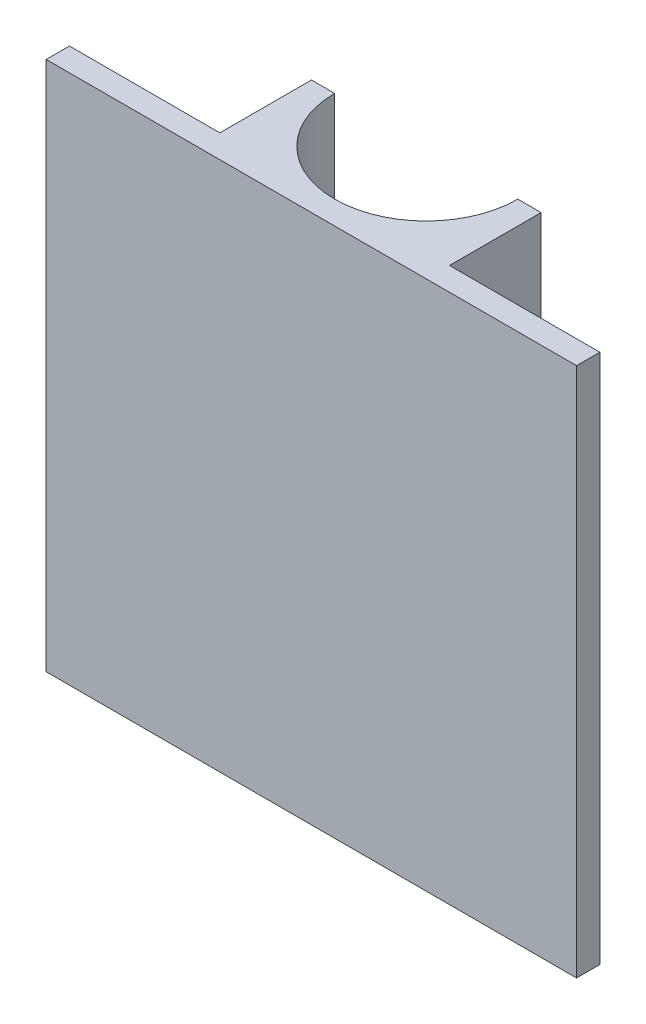
ISO-10303-21;
HEADER;
FILE_DESCRIPTION(('STEP AP214'),'2;1');
FILE_NAME('part.step','',(''),(''),'','','');
FILE_SCHEMA(('AUTOMOTIVE_DESIGN { 1 0 10303 214 1 1 1 1 }'));
ENDSEC;
DATA;
#1=APPLICATION_CONTEXT('core data for automotive mechanical design processes');
#2=APPLICATION_PROTOCOL_DEFINITION('international standard','automotive_design',2000,#1);
#3=PRODUCT_CONTEXT('',#1,'mechanical');
#4=PRODUCT('Part','Part','',(#3));
#5=PRODUCT_RELATED_PRODUCT_CATEGORY('part','',(#4));
#6=PRODUCT_DEFINITION_FORMATION('','',#4);
#7=PRODUCT_DEFINITION_CONTEXT('part definition',#1,'design');
#8=PRODUCT_DEFINITION('design','',#6,#7);
#9=PRODUCT_DEFINITION_SHAPE('','',#8);
#10=(LENGTH_UNIT() NAMED_UNIT(*) SI_UNIT(.MILLI.,.METRE.));
#11=(NAMED_UNIT(*) PLANE_ANGLE_UNIT() SI_UNIT($,.RADIAN.));
#12=(NAMED_UNIT(*) SI_UNIT($,.STERADIAN.) SOLID_ANGLE_UNIT());
#13=UNCERTAINTY_MEASURE_WITH_UNIT(LENGTH_MEASURE(1.E-05),#10,'distance_accuracy_value','');
#14=(GEOMETRIC_REPRESENTATION_CONTEXT(3) GLOBAL_UNCERTAINTY_ASSIGNED_CONTEXT((#13)) GLOBAL_UNIT_ASSIGNED_CONTEXT((#10,
#11,#12)) REPRESENTATION_CONTEXT('',''));
#15=CARTESIAN_POINT('',(0.,0.,0.));
#16=DIRECTION('',(0.,0.,1.));
#17=DIRECTION('',(1.,0.,0.));
#18=AXIS2_PLACEMENT_3D('',#15,#16,#17);
#19=CARTESIAN_POINT('',(0.,51.39,-17.6981702709716));
#20=DIRECTION('',(0.,0.,-1.));
#21=DIRECTION('',(-1.,0.,0.));
#22=AXIS2_PLACEMENT_3D('',#19,#20,#21);
#23=PLANE('',#22);
#24=DIRECTION('',(1.,0.,0.));
#25=VECTOR('',#24,1.);
#26=CARTESIAN_POINT('',(0.,0.,-17.6981702709716));
#27=LINE('',#26,#25);
#28=CARTESIAN_POINT('',(22.203311604388,0.,-17.6981702709716));
#29=VERTEX_POINT('',#28);
#30=CARTESIAN_POINT('',(42.7190570735429,0.,-17.6981702709716));
#31=VERTEX_POINT('',#30);
#32=EDGE_CURVE('E218',#29,#31,#27,.T.);
#33=ORIENTED_EDGE('',*,*,#32,.F.);
#34=DIRECTION('',(0.,-1.,0.));
#35=VECTOR('',#34,1.);
#36=CARTESIAN_POINT('',(22.203311604388,51.39,-17.6981702709716));
#37=LINE('',#36,#35);
#38=CARTESIAN_POINT('',(22.203311604388,72.39,-17.6981702709716));
#39=VERTEX_POINT('',#38);
#40=EDGE_CURVE('E171',#39,#29,#37,.T.);
#41=ORIENTED_EDGE('',*,*,#40,.F.);
#42=DIRECTION('',(1.,0.,0.));
#43=VECTOR('',#42,1.);
#44=CARTESIAN_POINT('',(0.,72.39,-17.6981702709716));
#45=LINE('',#44,#43);
#46=CARTESIAN_POINT('',(42.7190570735429,72.39,-17.6981702709716));
#47=VERTEX_POINT('',#46);
#48=EDGE_CURVE('E178',#39,#47,#45,.T.);
#49=ORIENTED_EDGE('',*,*,#48,.T.);
#50=DIRECTION('',(0.,-1.,0.));
#51=VECTOR('',#50,1.);
#52=CARTESIAN_POINT('',(42.7190570735429,51.39,-17.6981702709716));
#53=LINE('',#52,#51);
#54=EDGE_CURVE('E85',#47,#31,#53,.T.);
#55=ORIENTED_EDGE('',*,*,#54,.T.);
#56=EDGE_LOOP('',(#33,#41,#49,#55));
#57=FACE_BOUND('',#56,.T.);
#58=ADVANCED_FACE('F77',(#57),#23,.T.);
#59=CARTESIAN_POINT('',(22.203311604388,51.39,0.));
#60=DIRECTION('',(1.,0.,0.));
#61=DIRECTION('',(0.,0.,-1.));
#62=AXIS2_PLACEMENT_3D('',#59,#60,#61);
#63=PLANE('',#62);
#64=DIRECTION('',(0.,0.,1.));
#65=VECTOR('',#64,1.);
#66=CARTESIAN_POINT('',(22.203311604388,0.,0.));
#67=LINE('',#66,#65);
#68=CARTESIAN_POINT('',(22.203311604388,0.,-30.1981702709716));
#69=VERTEX_POINT('',#68);
#70=EDGE_CURVE('E221',#69,#29,#67,.T.);
#71=ORIENTED_EDGE('',*,*,#70,.F.);
#72=DIRECTION('',(0.,-1.,0.));
#73=VECTOR('',#72,1.);
#74=CARTESIAN_POINT('',(22.203311604388,51.39,-30.1981702709716));
#75=LINE('',#74,#73);
#76=CARTESIAN_POINT('',(22.203311604388,72.39,-30.1981702709716));
#77=VERTEX_POINT('',#76);
#78=EDGE_CURVE('E247',#77,#69,#75,.T.);
#79=ORIENTED_EDGE('',*,*,#78,.F.);
#80=DIRECTION('',(0.,0.,1.));
#81=VECTOR('',#80,1.);
#82=CARTESIAN_POINT('',(22.203311604388,72.39,0.));
#83=LINE('',#82,#81);
#84=EDGE_CURVE('E184',#77,#39,#83,.T.);
#85=ORIENTED_EDGE('',*,*,#84,.T.);
#86=ORIENTED_EDGE('',*,*,#40,.T.);
#87=EDGE_LOOP('',(#71,#79,#85,#86));
#88=FACE_BOUND('',#87,.T.);
#89=ADVANCED_FACE('F282',(#88),#63,.T.);
#90=CARTESIAN_POINT('',(0.,51.39,-30.1981702709716));
#91=DIRECTION('',(0.,0.,1.));
#92=DIRECTION('',(1.,0.,0.));
#93=AXIS2_PLACEMENT_3D('',#90,#91,#92);
#94=PLANE('',#93);
#95=DIRECTION('',(-1.,0.,0.));
#96=VECTOR('',#95,1.);
#97=CARTESIAN_POINT('',(0.,51.39,-30.1981702709716));
#98=LINE('',#97,#96);
#99=CARTESIAN_POINT('',(19.028311604388,51.39,-30.1981702709716));
#100=VERTEX_POINT('',#99);
#101=CARTESIAN_POINT('',(18.7283116,51.39,-30.1981702709716));
#102=VERTEX_POINT('',#101);
#103=EDGE_CURVE('E212',#100,#102,#98,.T.);
#104=ORIENTED_EDGE('',*,*,#103,.F.);
#105=DIRECTION('',(0.,-1.,0.));
#106=VECTOR('',#105,1.);
#107=CARTESIAN_POINT('',(19.028311604388,72.39,-30.1981702709716));
#108=LINE('',#107,#106);
#109=CARTESIAN_POINT('',(19.028311604388,72.39,-30.1981702709716));
#110=VERTEX_POINT('',#109);
#111=EDGE_CURVE('E208',#110,#100,#108,.T.);
#112=ORIENTED_EDGE('',*,*,#111,.F.);
#113=DIRECTION('',(-1.,0.,0.));
#114=VECTOR('',#113,1.);
#115=CARTESIAN_POINT('',(0.,72.39,-30.1981702709716));
#116=LINE('',#115,#114);
#117=EDGE_CURVE('E187',#77,#110,#116,.T.);
#118=ORIENTED_EDGE('',*,*,#117,.F.);
#119=ORIENTED_EDGE('',*,*,#78,.T.);
#120=DIRECTION('',(-1.,0.,0.));
#121=VECTOR('',#120,1.);
#122=CARTESIAN_POINT('',(0.,0.,-30.1981702709716));
#123=LINE('',#122,#121);
#124=CARTESIAN_POINT('',(18.7283116,0.,-30.1981702709716));
#125=VERTEX_POINT('',#124);
#126=EDGE_CURVE('E225',#69,#125,#123,.T.);
#127=ORIENTED_EDGE('',*,*,#126,.T.);
#128=DIRECTION('',(0.,-1.,0.));
#129=VECTOR('',#128,1.);
#130=CARTESIAN_POINT('',(18.7283116,51.39,-30.1981702709716));
#131=LINE('',#130,#129);
#132=EDGE_CURVE('E219',#102,#125,#131,.T.);
#133=ORIENTED_EDGE('',*,*,#132,.F.);
#134=EDGE_LOOP('',(#104,#112,#118,#119,#127,#133));
#135=FACE_BOUND('',#134,.T.);
#136=ADVANCED_FACE('F273',(#135),#94,.F.);
#137=CARTESIAN_POINT('',(0.,51.39,-30.1981702709716));
#138=DIRECTION('',(0.,0.,1.));
#139=DIRECTION('',(1.,0.,0.));
#140=AXIS2_PLACEMENT_3D('',#137,#138,#139);
#141=PLANE('',#140);
#142=DIRECTION('',(-1.,0.,0.));
#143=VECTOR('',#142,1.);
#144=CARTESIAN_POINT('',(0.,0.,-30.1981702709716));
#145=LINE('',#144,#143);
#146=CARTESIAN_POINT('',(-5.67168840000001,0.,-30.1981702709716));
#147=VERTEX_POINT('',#146);
#148=CARTESIAN_POINT('',(-9.146688395612,0.,-30.1981702709716));
#149=VERTEX_POINT('',#148);
#150=EDGE_CURVE('E227',#147,#149,#145,.T.);
#151=ORIENTED_EDGE('',*,*,#150,.T.);
#152=DIRECTION('',(0.,-1.,0.));
#153=VECTOR('',#152,1.);
#154=CARTESIAN_POINT('',(-9.146688395612,51.39,-30.1981702709716));
#155=LINE('',#154,#153);
#156=CARTESIAN_POINT('',(-9.146688395612,72.39,-30.1981702709716));
#157=VERTEX_POINT('',#156);
#158=EDGE_CURVE('E244',#157,#149,#155,.T.);
#159=ORIENTED_EDGE('',*,*,#158,.F.);
#160=DIRECTION('',(-1.,0.,0.));
#161=VECTOR('',#160,1.);
#162=CARTESIAN_POINT('',(0.,72.39,-30.1981702709716));
#163=LINE('',#162,#161);
#164=CARTESIAN_POINT('',(-5.971688395612,72.39,-30.1981702709716));
#165=VERTEX_POINT('',#164);
#166=EDGE_CURVE('E196',#165,#157,#163,.T.);
#167=ORIENTED_EDGE('',*,*,#166,.F.);
#168=DIRECTION('',(0.,-1.,0.));
#169=VECTOR('',#168,1.);
#170=CARTESIAN_POINT('',(-5.971688395612,72.39,-30.1981702709716));
#171=LINE('',#170,#169);
#172=CARTESIAN_POINT('',(-5.971688395612,51.39,-30.1981702709716));
#173=VERTEX_POINT('',#172);
#174=EDGE_CURVE('E205',#165,#173,#171,.T.);
#175=ORIENTED_EDGE('',*,*,#174,.T.);
#176=DIRECTION('',(-1.,0.,0.));
#177=VECTOR('',#176,1.);
#178=CARTESIAN_POINT('',(0.,51.39,-30.1981702709716));
#179=LINE('',#178,#177);
#180=CARTESIAN_POINT('',(-5.67168840000001,51.39,-30.1981702709716));
#181=VERTEX_POINT('',#180);
#182=EDGE_CURVE('E92',#181,#173,#179,.T.);
#183=ORIENTED_EDGE('',*,*,#182,.F.);
#184=DIRECTION('',(0.,-1.,0.));
#185=VECTOR('',#184,1.);
#186=CARTESIAN_POINT('',(-5.67168840000001,51.39,-30.1981702709716));
#187=LINE('',#186,#185);
#188=EDGE_CURVE('E253',#181,#147,#187,.T.);
#189=ORIENTED_EDGE('',*,*,#188,.T.);
#190=EDGE_LOOP('',(#151,#159,#167,#175,#183,#189));
#191=FACE_BOUND('',#190,.T.);
#192=ADVANCED_FACE('F270',(#191),#141,.F.);
#193=CARTESIAN_POINT('',(-9.146688395612,51.39,0.));
#194=DIRECTION('',(1.,0.,0.));
#195=DIRECTION('',(0.,0.,-1.));
#196=AXIS2_PLACEMENT_3D('',#193,#194,#195);
#197=PLANE('',#196);
#198=DIRECTION('',(0.,0.,1.));
#199=VECTOR('',#198,1.);
#200=CARTESIAN_POINT('',(-9.146688395612,0.,0.));
#201=LINE('',#200,#199);
#202=CARTESIAN_POINT('',(-9.146688395612,0.,-17.6981702709716));
#203=VERTEX_POINT('',#202);
#204=EDGE_CURVE('E229',#149,#203,#201,.T.);
#205=ORIENTED_EDGE('',*,*,#204,.T.);
#206=DIRECTION('',(0.,-1.,0.));
#207=VECTOR('',#206,1.);
#208=CARTESIAN_POINT('',(-9.146688395612,51.39,-17.6981702709716));
#209=LINE('',#208,#207);
#210=CARTESIAN_POINT('',(-9.146688395612,72.39,-17.6981702709716));
#211=VERTEX_POINT('',#210);
#212=EDGE_CURVE('E242',#211,#203,#209,.T.);
#213=ORIENTED_EDGE('',*,*,#212,.F.);
#214=DIRECTION('',(0.,0.,1.));
#215=VECTOR('',#214,1.);
#216=CARTESIAN_POINT('',(-9.146688395612,72.39,0.));
#217=LINE('',#216,#215);
#218=EDGE_CURVE('E191',#157,#211,#217,.T.);
#219=ORIENTED_EDGE('',*,*,#218,.F.);
#220=ORIENTED_EDGE('',*,*,#158,.T.);
#221=EDGE_LOOP('',(#205,#213,#219,#220));
#222=FACE_BOUND('',#221,.T.);
#223=ADVANCED_FACE('F293',(#222),#197,.F.);
#224=CARTESIAN_POINT('',(-29.6816044258831,0.,-17.6981702709716));
#225=VERTEX_POINT('',#224);
#226=EDGE_CURVE('E222',#225,#203,#27,.T.);
#227=ORIENTED_EDGE('',*,*,#226,.F.);
#228=DIRECTION('',(0.,-1.,0.));
#229=VECTOR('',#228,1.);
#230=CARTESIAN_POINT('',(-29.6816044258831,51.39,-17.6981702709716));
#231=LINE('',#230,#229);
#232=CARTESIAN_POINT('',(-29.6816044258831,72.39,-17.6981702709716));
#233=VERTEX_POINT('',#232);
#234=EDGE_CURVE('E240',#233,#225,#231,.T.);
#235=ORIENTED_EDGE('',*,*,#234,.F.);
#236=EDGE_CURVE('E186',#233,#211,#45,.T.);
#237=ORIENTED_EDGE('',*,*,#236,.T.);
#238=ORIENTED_EDGE('',*,*,#212,.T.);
#239=EDGE_LOOP('',(#227,#235,#237,#238));
#240=FACE_BOUND('',#239,.T.);
#241=ADVANCED_FACE('F291',(#240),#23,.T.);
#242=CARTESIAN_POINT('',(-29.6816044258831,51.39,0.));
#243=DIRECTION('',(1.,0.,0.));
#244=DIRECTION('',(0.,0.,-1.));
#245=AXIS2_PLACEMENT_3D('',#242,#243,#244);
#246=PLANE('',#245);
#247=DIRECTION('',(0.,0.,1.));
#248=VECTOR('',#247,1.);
#249=CARTESIAN_POINT('',(-29.6816044258831,0.,0.));
#250=LINE('',#249,#248);
#251=CARTESIAN_POINT('',(-29.6816044258831,0.,-14.5231702709716));
#252=VERTEX_POINT('',#251);
#253=EDGE_CURVE('E232',#225,#252,#250,.T.);
#254=ORIENTED_EDGE('',*,*,#253,.T.);
#255=DIRECTION('',(0.,-1.,0.));
#256=VECTOR('',#255,1.);
#257=CARTESIAN_POINT('',(-29.6816044258831,51.39,-14.5231702709716));
#258=LINE('',#257,#256);
#259=CARTESIAN_POINT('',(-29.6816044258831,72.39,-14.5231702709716));
#260=VERTEX_POINT('',#259);
#261=EDGE_CURVE('E237',#260,#252,#258,.T.);
#262=ORIENTED_EDGE('',*,*,#261,.F.);
#263=DIRECTION('',(0.,0.,1.));
#264=VECTOR('',#263,1.);
#265=CARTESIAN_POINT('',(-29.6816044258831,72.39,0.));
#266=LINE('',#265,#264);
#267=EDGE_CURVE('E190',#233,#260,#266,.T.);
#268=ORIENTED_EDGE('',*,*,#267,.F.);
#269=ORIENTED_EDGE('',*,*,#234,.T.);
#270=EDGE_LOOP('',(#254,#262,#268,#269));
#271=FACE_BOUND('',#270,.T.);
#272=ADVANCED_FACE('F290',(#271),#246,.F.);
#273=CARTESIAN_POINT('',(0.,51.39,-14.5231702709716));
#274=DIRECTION('',(0.,0.,-1.));
#275=DIRECTION('',(-1.,0.,0.));
#276=AXIS2_PLACEMENT_3D('',#273,#274,#275);
#277=PLANE('',#276);
#278=DIRECTION('',(1.,0.,0.));
#279=VECTOR('',#278,1.);
#280=CARTESIAN_POINT('',(0.,0.,-14.5231702709716));
#281=LINE('',#280,#279);
#282=CARTESIAN_POINT('',(42.7190570735429,0.,-14.5231702709716));
#283=VERTEX_POINT('',#282);
#284=EDGE_CURVE('E214',#252,#283,#281,.T.);
#285=ORIENTED_EDGE('',*,*,#284,.T.);
#286=DIRECTION('',(0.,-1.,0.));
#287=VECTOR('',#286,1.);
#288=CARTESIAN_POINT('',(42.7190570735429,51.39,-14.5231702709716));
#289=LINE('',#288,#287);
#290=CARTESIAN_POINT('',(42.7190570735429,72.39,-14.5231702709716));
#291=VERTEX_POINT('',#290);
#292=EDGE_CURVE('E216',#291,#283,#289,.T.);
#293=ORIENTED_EDGE('',*,*,#292,.F.);
#294=DIRECTION('',(1.,0.,0.));
#295=VECTOR('',#294,1.);
#296=CARTESIAN_POINT('',(0.,72.39,-14.5231702709716));
#297=LINE('',#296,#295);
#298=EDGE_CURVE('E182',#260,#291,#297,.T.);
#299=ORIENTED_EDGE('',*,*,#298,.F.);
#300=ORIENTED_EDGE('',*,*,#261,.T.);
#301=EDGE_LOOP('',(#285,#293,#299,#300));
#302=FACE_BOUND('',#301,.T.);
#303=ADVANCED_FACE('F287',(#302),#277,.F.);
#304=CARTESIAN_POINT('',(42.7190570735429,51.39,0.));
#305=DIRECTION('',(1.,0.,0.));
#306=DIRECTION('',(0.,0.,-1.));
#307=AXIS2_PLACEMENT_3D('',#304,#305,#306);
#308=PLANE('',#307);
#309=DIRECTION('',(0.,0.,1.));
#310=VECTOR('',#309,1.);
#311=CARTESIAN_POINT('',(42.7190570735429,0.,0.));
#312=LINE('',#311,#310);
#313=EDGE_CURVE('E166',#31,#283,#312,.T.);
#314=ORIENTED_EDGE('',*,*,#313,.F.);
#315=ORIENTED_EDGE('',*,*,#54,.F.);
#316=DIRECTION('',(0.,0.,1.));
#317=VECTOR('',#316,1.);
#318=CARTESIAN_POINT('',(42.7190570735429,72.39,0.));
#319=LINE('',#318,#317);
#320=EDGE_CURVE('E164',#47,#291,#319,.T.);
#321=ORIENTED_EDGE('',*,*,#320,.T.);
#322=ORIENTED_EDGE('',*,*,#292,.T.);
#323=EDGE_LOOP('',(#314,#315,#321,#322));
#324=FACE_BOUND('',#323,.T.);
#325=ADVANCED_FACE('F163',(#324),#308,.T.);
#326=CARTESIAN_POINT('',(0.,0.,0.));
#327=DIRECTION('',(0.,1.,0.));
#328=DIRECTION('',(0.,0.,1.));
#329=AXIS2_PLACEMENT_3D('',#326,#327,#328);
#330=PLANE('',#329);
#331=CARTESIAN_POINT('',(6.5283116,0.,-30.19817027));
#332=DIRECTION('',(0.,1.,0.));
#333=DIRECTION('',(0.,0.,1.));
#334=AXIS2_PLACEMENT_3D('',#331,#332,#333);
#335=CIRCLE('',#334,12.2);
#336=EDGE_CURVE('E211',#147,#125,#335,.T.);
#337=ORIENTED_EDGE('',*,*,#336,.T.);
#338=ORIENTED_EDGE('',*,*,#126,.F.);
#339=ORIENTED_EDGE('',*,*,#70,.T.);
#340=ORIENTED_EDGE('',*,*,#32,.T.);
#341=ORIENTED_EDGE('',*,*,#313,.T.);
#342=ORIENTED_EDGE('',*,*,#284,.F.);
#343=ORIENTED_EDGE('',*,*,#253,.F.);
#344=ORIENTED_EDGE('',*,*,#226,.T.);
#345=ORIENTED_EDGE('',*,*,#204,.F.);
#346=ORIENTED_EDGE('',*,*,#150,.F.);
#347=EDGE_LOOP('',(#337,#338,#339,#340,#341,#342,#343,#344,#345,#346));
#348=FACE_BOUND('',#347,.T.);
#349=ADVANCED_FACE('F265',(#348),#330,.F.);
#350=CARTESIAN_POINT('',(0.,51.39,0.));
#351=DIRECTION('',(0.,1.,0.));
#352=DIRECTION('',(0.,0.,1.));
#353=AXIS2_PLACEMENT_3D('',#350,#351,#352);
#354=PLANE('',#353);
#355=CARTESIAN_POINT('',(6.528311604388,51.39,-30.1981702709716));
#356=DIRECTION('',(0.,1.,0.));
#357=DIRECTION('',(0.,0.,1.));
#358=AXIS2_PLACEMENT_3D('',#355,#356,#357);
#359=CIRCLE('',#358,12.5);
#360=EDGE_CURVE('E12',#100,#173,#359,.F.);
#361=ORIENTED_EDGE('',*,*,#360,.F.);
#362=ORIENTED_EDGE('',*,*,#103,.T.);
#363=CARTESIAN_POINT('',(6.5283116,51.39,-30.19817027));
#364=DIRECTION('',(0.,1.,0.));
#365=DIRECTION('',(0.,0.,1.));
#366=AXIS2_PLACEMENT_3D('',#363,#364,#365);
#367=CIRCLE('',#366,12.2);
#368=EDGE_CURVE('E250',#181,#102,#367,.T.);
#369=ORIENTED_EDGE('',*,*,#368,.F.);
#370=ORIENTED_EDGE('',*,*,#182,.T.);
#371=EDGE_LOOP('',(#361,#362,#369,#370));
#372=FACE_BOUND('',#371,.T.);
#373=ADVANCED_FACE('F271',(#372),#354,.T.);
#374=CARTESIAN_POINT('',(6.5283116,51.39,-30.19817027));
#375=DIRECTION('',(0.,-1.,0.));
#376=DIRECTION('',(0.,0.,-1.));
#377=AXIS2_PLACEMENT_3D('',#374,#375,#376);
#378=CYLINDRICAL_SURFACE('',#377,12.2);
#379=ORIENTED_EDGE('',*,*,#336,.F.);
#380=ORIENTED_EDGE('',*,*,#188,.F.);
#381=ORIENTED_EDGE('',*,*,#368,.T.);
#382=ORIENTED_EDGE('',*,*,#132,.T.);
#383=EDGE_LOOP('',(#379,#380,#381,#382));
#384=FACE_BOUND('',#383,.T.);
#385=ADVANCED_FACE('F79',(#384),#378,.F.);
#386=CARTESIAN_POINT('',(6.528311604388,72.39,-30.1981702709716));
#387=DIRECTION('',(0.,-1.,0.));
#388=DIRECTION('',(0.,0.,-1.));
#389=AXIS2_PLACEMENT_3D('',#386,#387,#388);
#390=CYLINDRICAL_SURFACE('',#389,12.5);
#391=ORIENTED_EDGE('',*,*,#111,.T.);
#392=ORIENTED_EDGE('',*,*,#360,.T.);
#393=ORIENTED_EDGE('',*,*,#174,.F.);
#394=CARTESIAN_POINT('',(6.528311604388,72.39,-30.1981702709716));
#395=DIRECTION('',(0.,1.,0.));
#396=DIRECTION('',(0.,0.,1.));
#397=AXIS2_PLACEMENT_3D('',#394,#395,#396);
#398=CIRCLE('',#397,12.5);
#399=EDGE_CURVE('E200',#165,#110,#398,.T.);
#400=ORIENTED_EDGE('',*,*,#399,.T.);
#401=EDGE_LOOP('',(#391,#392,#393,#400));
#402=FACE_BOUND('',#401,.T.);
#403=ADVANCED_FACE('F277',(#402),#390,.F.);
#404=CARTESIAN_POINT('',(0.,72.39,0.));
#405=DIRECTION('',(0.,1.,0.));
#406=DIRECTION('',(0.,0.,1.));
#407=AXIS2_PLACEMENT_3D('',#404,#405,#406);
#408=PLANE('',#407);
#409=ORIENTED_EDGE('',*,*,#320,.F.);
#410=ORIENTED_EDGE('',*,*,#48,.F.);
#411=ORIENTED_EDGE('',*,*,#84,.F.);
#412=ORIENTED_EDGE('',*,*,#117,.T.);
#413=ORIENTED_EDGE('',*,*,#399,.F.);
#414=ORIENTED_EDGE('',*,*,#166,.T.);
#415=ORIENTED_EDGE('',*,*,#218,.T.);
#416=ORIENTED_EDGE('',*,*,#236,.F.);
#417=ORIENTED_EDGE('',*,*,#267,.T.);
#418=ORIENTED_EDGE('',*,*,#298,.T.);
#419=EDGE_LOOP('',(#409,#410,#411,#412,#413,#414,#415,#416,#417,#418));
#420=FACE_BOUND('',#419,.T.);
#421=ADVANCED_FACE('F176',(#420),#408,.T.);
#422=CLOSED_SHELL('',(#58,#89,#136,#192,#223,#241,#272,#303,#325,#349,#373,#385,#403,#421));
#423=MANIFOLD_SOLID_BREP('B2',#422);
#424=ADVANCED_BREP_SHAPE_REPRESENTATION('',(#18,#423),#14);
#425=SHAPE_DEFINITION_REPRESENTATION(#9,#424);
ENDSEC;
END-ISO-10303-21;
